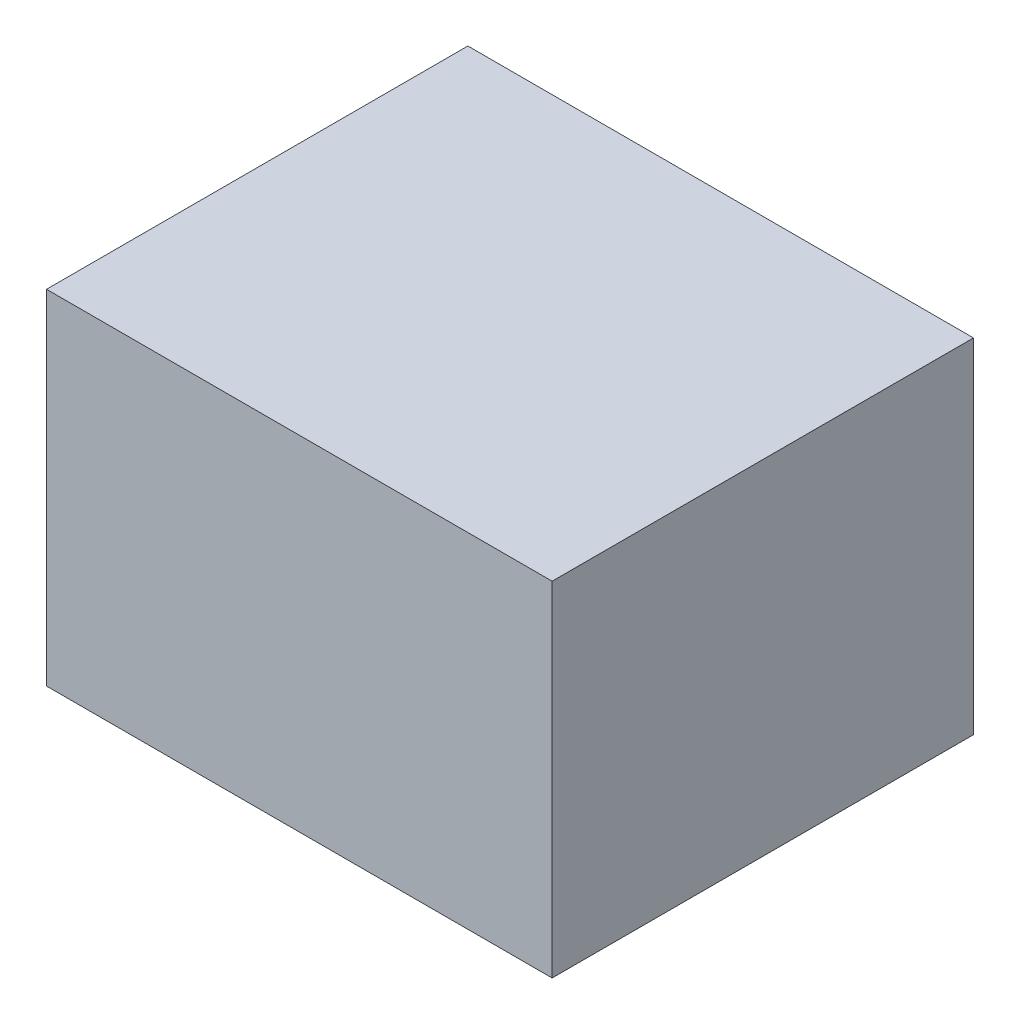
ISO-10303-21;
HEADER;
FILE_DESCRIPTION(('STEP AP214'),'2;1');
FILE_NAME('part.step','',(''),(''),'','','');
FILE_SCHEMA(('AUTOMOTIVE_DESIGN { 1 0 10303 214 1 1 1 1 }'));
ENDSEC;
DATA;
#1=APPLICATION_CONTEXT('core data for automotive mechanical design processes');
#2=APPLICATION_PROTOCOL_DEFINITION('international standard','automotive_design',2000,#1);
#3=PRODUCT_CONTEXT('',#1,'mechanical');
#4=PRODUCT('Part','Part','',(#3));
#5=PRODUCT_RELATED_PRODUCT_CATEGORY('part','',(#4));
#6=PRODUCT_DEFINITION_FORMATION('','',#4);
#7=PRODUCT_DEFINITION_CONTEXT('part definition',#1,'design');
#8=PRODUCT_DEFINITION('design','',#6,#7);
#9=PRODUCT_DEFINITION_SHAPE('','',#8);
#10=(LENGTH_UNIT() NAMED_UNIT(*) SI_UNIT(.MILLI.,.METRE.));
#11=(NAMED_UNIT(*) PLANE_ANGLE_UNIT() SI_UNIT($,.RADIAN.));
#12=(NAMED_UNIT(*) SI_UNIT($,.STERADIAN.) SOLID_ANGLE_UNIT());
#13=UNCERTAINTY_MEASURE_WITH_UNIT(LENGTH_MEASURE(1.E-05),#10,'distance_accuracy_value','');
#14=(GEOMETRIC_REPRESENTATION_CONTEXT(3) GLOBAL_UNCERTAINTY_ASSIGNED_CONTEXT((#13)) GLOBAL_UNIT_ASSIGNED_CONTEXT((#10,
#11,#12)) REPRESENTATION_CONTEXT('',''));
#15=CARTESIAN_POINT('',(0.,0.,0.));
#16=DIRECTION('',(0.,0.,1.));
#17=DIRECTION('',(1.,0.,0.));
#18=AXIS2_PLACEMENT_3D('',#15,#16,#17);
#19=CARTESIAN_POINT('',(0.,0.,60.325));
#20=DIRECTION('',(1.,0.,0.));
#21=DIRECTION('',(0.,0.,-1.));
#22=AXIS2_PLACEMENT_3D('',#19,#20,#21);
#23=PLANE('',#22);
#24=DIRECTION('',(0.,-1.,0.));
#25=VECTOR('',#24,1.);
#26=CARTESIAN_POINT('',(0.,0.,0.));
#27=LINE('',#26,#25);
#28=CARTESIAN_POINT('',(0.,49.1998,0.));
#29=VERTEX_POINT('',#28);
#30=CARTESIAN_POINT('',(0.,0.,0.));
#31=VERTEX_POINT('',#30);
#32=EDGE_CURVE('E97',#29,#31,#27,.T.);
#33=ORIENTED_EDGE('',*,*,#32,.T.);
#34=DIRECTION('',(0.,0.,-1.));
#35=VECTOR('',#34,1.);
#36=CARTESIAN_POINT('',(0.,0.,60.325));
#37=LINE('',#36,#35);
#38=CARTESIAN_POINT('',(0.,0.,60.325));
#39=VERTEX_POINT('',#38);
#40=EDGE_CURVE('E11',#39,#31,#37,.T.);
#41=ORIENTED_EDGE('',*,*,#40,.F.);
#42=DIRECTION('',(0.,-1.,0.));
#43=VECTOR('',#42,1.);
#44=CARTESIAN_POINT('',(0.,0.,60.325));
#45=LINE('',#44,#43);
#46=CARTESIAN_POINT('',(0.,49.1998,60.325));
#47=VERTEX_POINT('',#46);
#48=EDGE_CURVE('E85',#47,#39,#45,.T.);
#49=ORIENTED_EDGE('',*,*,#48,.F.);
#50=DIRECTION('',(0.,0.,-1.));
#51=VECTOR('',#50,1.);
#52=CARTESIAN_POINT('',(0.,49.1998,60.325));
#53=LINE('',#52,#51);
#54=EDGE_CURVE('E93',#47,#29,#53,.T.);
#55=ORIENTED_EDGE('',*,*,#54,.T.);
#56=EDGE_LOOP('',(#33,#41,#49,#55));
#57=FACE_BOUND('',#56,.T.);
#58=ADVANCED_FACE('F34',(#57),#23,.F.);
#59=CARTESIAN_POINT('',(0.,0.,60.325));
#60=DIRECTION('',(0.,1.,0.));
#61=DIRECTION('',(0.,0.,1.));
#62=AXIS2_PLACEMENT_3D('',#59,#60,#61);
#63=PLANE('',#62);
#64=DIRECTION('',(1.,0.,0.));
#65=VECTOR('',#64,1.);
#66=CARTESIAN_POINT('',(0.,0.,0.));
#67=LINE('',#66,#65);
#68=CARTESIAN_POINT('',(72.39,0.,0.));
#69=VERTEX_POINT('',#68);
#70=EDGE_CURVE('E89',#31,#69,#67,.T.);
#71=ORIENTED_EDGE('',*,*,#70,.T.);
#72=DIRECTION('',(0.,0.,-1.));
#73=VECTOR('',#72,1.);
#74=CARTESIAN_POINT('',(72.39,0.,60.325));
#75=LINE('',#74,#73);
#76=CARTESIAN_POINT('',(72.39,0.,60.325));
#77=VERTEX_POINT('',#76);
#78=EDGE_CURVE('E42',#77,#69,#75,.T.);
#79=ORIENTED_EDGE('',*,*,#78,.F.);
#80=DIRECTION('',(1.,0.,0.));
#81=VECTOR('',#80,1.);
#82=CARTESIAN_POINT('',(0.,0.,60.325));
#83=LINE('',#82,#81);
#84=EDGE_CURVE('E80',#39,#77,#83,.T.);
#85=ORIENTED_EDGE('',*,*,#84,.F.);
#86=ORIENTED_EDGE('',*,*,#40,.T.);
#87=EDGE_LOOP('',(#71,#79,#85,#86));
#88=FACE_BOUND('',#87,.T.);
#89=ADVANCED_FACE('F88',(#88),#63,.F.);
#90=CARTESIAN_POINT('',(72.39,0.,60.325));
#91=DIRECTION('',(-1.,0.,0.));
#92=DIRECTION('',(0.,0.,1.));
#93=AXIS2_PLACEMENT_3D('',#90,#91,#92);
#94=PLANE('',#93);
#95=DIRECTION('',(0.,1.,0.));
#96=VECTOR('',#95,1.);
#97=CARTESIAN_POINT('',(72.39,0.,0.));
#98=LINE('',#97,#96);
#99=CARTESIAN_POINT('',(72.39,49.1998,0.));
#100=VERTEX_POINT('',#99);
#101=EDGE_CURVE('E67',#69,#100,#98,.T.);
#102=ORIENTED_EDGE('',*,*,#101,.T.);
#103=DIRECTION('',(0.,0.,-1.));
#104=VECTOR('',#103,1.);
#105=CARTESIAN_POINT('',(72.39,49.1998,60.325));
#106=LINE('',#105,#104);
#107=CARTESIAN_POINT('',(72.39,49.1998,60.325));
#108=VERTEX_POINT('',#107);
#109=EDGE_CURVE('E90',#108,#100,#106,.T.);
#110=ORIENTED_EDGE('',*,*,#109,.F.);
#111=DIRECTION('',(0.,1.,0.));
#112=VECTOR('',#111,1.);
#113=CARTESIAN_POINT('',(72.39,0.,60.325));
#114=LINE('',#113,#112);
#115=EDGE_CURVE('E83',#77,#108,#114,.T.);
#116=ORIENTED_EDGE('',*,*,#115,.F.);
#117=ORIENTED_EDGE('',*,*,#78,.T.);
#118=EDGE_LOOP('',(#102,#110,#116,#117));
#119=FACE_BOUND('',#118,.T.);
#120=ADVANCED_FACE('F91',(#119),#94,.F.);
#121=CARTESIAN_POINT('',(0.,49.1998,60.325));
#122=DIRECTION('',(0.,-1.,0.));
#123=DIRECTION('',(0.,0.,-1.));
#124=AXIS2_PLACEMENT_3D('',#121,#122,#123);
#125=PLANE('',#124);
#126=DIRECTION('',(-1.,0.,0.));
#127=VECTOR('',#126,1.);
#128=CARTESIAN_POINT('',(0.,49.1998,0.));
#129=LINE('',#128,#127);
#130=EDGE_CURVE('E73',#100,#29,#129,.T.);
#131=ORIENTED_EDGE('',*,*,#130,.T.);
#132=ORIENTED_EDGE('',*,*,#54,.F.);
#133=DIRECTION('',(-1.,0.,0.));
#134=VECTOR('',#133,1.);
#135=CARTESIAN_POINT('',(0.,49.1998,60.325));
#136=LINE('',#135,#134);
#137=EDGE_CURVE('E50',#108,#47,#136,.T.);
#138=ORIENTED_EDGE('',*,*,#137,.F.);
#139=ORIENTED_EDGE('',*,*,#109,.T.);
#140=EDGE_LOOP('',(#131,#132,#138,#139));
#141=FACE_BOUND('',#140,.T.);
#142=ADVANCED_FACE('F104',(#141),#125,.F.);
#143=CARTESIAN_POINT('',(0.,0.,60.325));
#144=DIRECTION('',(0.,0.,-1.));
#145=DIRECTION('',(-1.,0.,0.));
#146=AXIS2_PLACEMENT_3D('',#143,#144,#145);
#147=PLANE('',#146);
#148=ORIENTED_EDGE('',*,*,#48,.T.);
#149=ORIENTED_EDGE('',*,*,#84,.T.);
#150=ORIENTED_EDGE('',*,*,#115,.T.);
#151=ORIENTED_EDGE('',*,*,#137,.T.);
#152=EDGE_LOOP('',(#148,#149,#150,#151));
#153=FACE_BOUND('',#152,.T.);
#154=ADVANCED_FACE('F81',(#153),#147,.F.);
#155=CARTESIAN_POINT('',(0.,0.,0.));
#156=DIRECTION('',(0.,0.,-1.));
#157=DIRECTION('',(-1.,0.,0.));
#158=AXIS2_PLACEMENT_3D('',#155,#156,#157);
#159=PLANE('',#158);
#160=ORIENTED_EDGE('',*,*,#32,.F.);
#161=ORIENTED_EDGE('',*,*,#130,.F.);
#162=ORIENTED_EDGE('',*,*,#101,.F.);
#163=ORIENTED_EDGE('',*,*,#70,.F.);
#164=EDGE_LOOP('',(#160,#161,#162,#163));
#165=FACE_BOUND('',#164,.T.);
#166=ADVANCED_FACE('F107',(#165),#159,.T.);
#167=CLOSED_SHELL('',(#58,#89,#120,#142,#154,#166));
#168=MANIFOLD_SOLID_BREP('B2',#167);
#169=ADVANCED_BREP_SHAPE_REPRESENTATION('',(#18,#168),#14);
#170=SHAPE_DEFINITION_REPRESENTATION(#9,#169);
ENDSEC;
END-ISO-10303-21;
